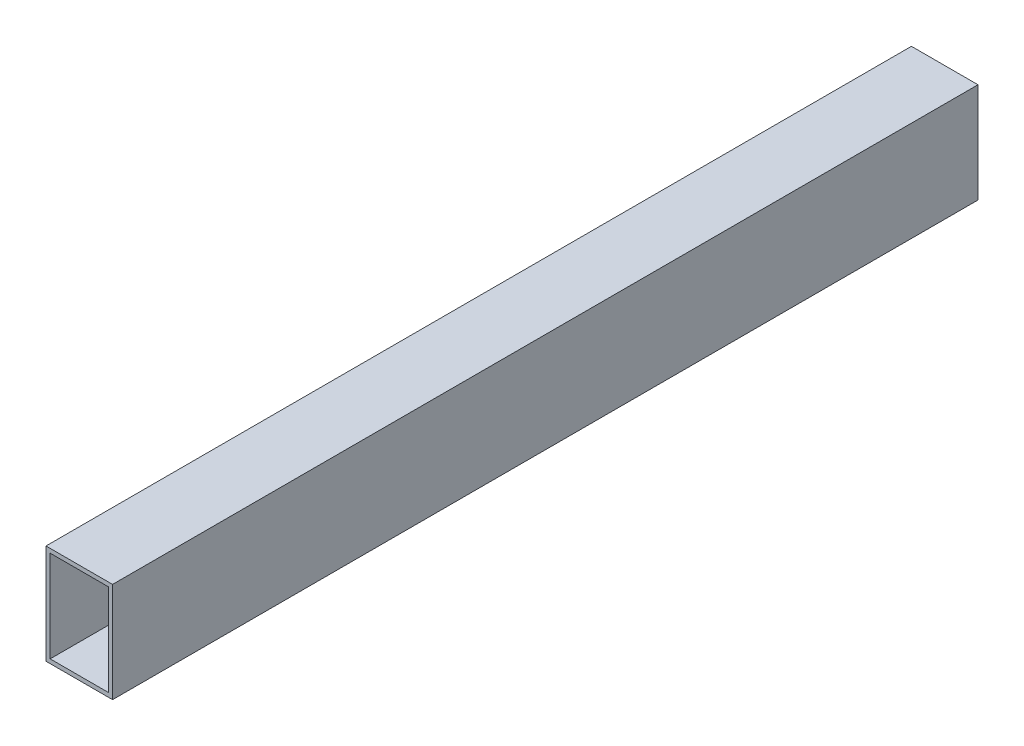
ISO-10303-21;
HEADER;
FILE_DESCRIPTION(('STEP AP214'),'2;1');
FILE_NAME('part.step','',(''),(''),'','','');
FILE_SCHEMA(('AUTOMOTIVE_DESIGN { 1 0 10303 214 1 1 1 1 }'));
ENDSEC;
DATA;
#1=APPLICATION_CONTEXT('core data for automotive mechanical design processes');
#2=APPLICATION_PROTOCOL_DEFINITION('international standard','automotive_design',2000,#1);
#3=PRODUCT_CONTEXT('',#1,'mechanical');
#4=PRODUCT('Part','Part','',(#3));
#5=PRODUCT_RELATED_PRODUCT_CATEGORY('part','',(#4));
#6=PRODUCT_DEFINITION_FORMATION('','',#4);
#7=PRODUCT_DEFINITION_CONTEXT('part definition',#1,'design');
#8=PRODUCT_DEFINITION('design','',#6,#7);
#9=PRODUCT_DEFINITION_SHAPE('','',#8);
#10=(LENGTH_UNIT() NAMED_UNIT(*) SI_UNIT(.MILLI.,.METRE.));
#11=(NAMED_UNIT(*) PLANE_ANGLE_UNIT() SI_UNIT($,.RADIAN.));
#12=(NAMED_UNIT(*) SI_UNIT($,.STERADIAN.) SOLID_ANGLE_UNIT());
#13=UNCERTAINTY_MEASURE_WITH_UNIT(LENGTH_MEASURE(1.E-05),#10,'distance_accuracy_value','');
#14=(GEOMETRIC_REPRESENTATION_CONTEXT(3) GLOBAL_UNCERTAINTY_ASSIGNED_CONTEXT((#13)) GLOBAL_UNIT_ASSIGNED_CONTEXT((#10,
#11,#12)) REPRESENTATION_CONTEXT('',''));
#15=CARTESIAN_POINT('',(0.,0.,0.));
#16=DIRECTION('',(0.,0.,1.));
#17=DIRECTION('',(1.,0.,0.));
#18=AXIS2_PLACEMENT_3D('',#15,#16,#17);
#19=CARTESIAN_POINT('',(25.4,38.1,660.4));
#20=DIRECTION('',(-1.,0.,0.));
#21=DIRECTION('',(0.,-1.,0.));
#22=AXIS2_PLACEMENT_3D('',#19,#20,#21);
#23=PLANE('',#22);
#24=DIRECTION('',(0.,1.,0.));
#25=VECTOR('',#24,1.);
#26=CARTESIAN_POINT('',(25.4,38.1,0.));
#27=LINE('',#26,#25);
#28=CARTESIAN_POINT('',(25.4,-38.1,0.));
#29=VERTEX_POINT('',#28);
#30=CARTESIAN_POINT('',(25.4,38.1,0.));
#31=VERTEX_POINT('',#30);
#32=EDGE_CURVE('E145',#29,#31,#27,.T.);
#33=ORIENTED_EDGE('',*,*,#32,.T.);
#34=DIRECTION('',(0.,0.,-1.));
#35=VECTOR('',#34,1.);
#36=CARTESIAN_POINT('',(25.4,38.1,660.4));
#37=LINE('',#36,#35);
#38=CARTESIAN_POINT('',(25.4,38.1,660.4));
#39=VERTEX_POINT('',#38);
#40=EDGE_CURVE('E11',#39,#31,#37,.T.);
#41=ORIENTED_EDGE('',*,*,#40,.F.);
#42=DIRECTION('',(0.,1.,0.));
#43=VECTOR('',#42,1.);
#44=CARTESIAN_POINT('',(25.4,38.1,660.4));
#45=LINE('',#44,#43);
#46=CARTESIAN_POINT('',(25.4,-38.1,660.4));
#47=VERTEX_POINT('',#46);
#48=EDGE_CURVE('E134',#47,#39,#45,.T.);
#49=ORIENTED_EDGE('',*,*,#48,.F.);
#50=DIRECTION('',(0.,0.,-1.));
#51=VECTOR('',#50,1.);
#52=CARTESIAN_POINT('',(25.4,-38.1,660.4));
#53=LINE('',#52,#51);
#54=EDGE_CURVE('E144',#47,#29,#53,.T.);
#55=ORIENTED_EDGE('',*,*,#54,.T.);
#56=EDGE_LOOP('',(#33,#41,#49,#55));
#57=FACE_BOUND('',#56,.T.);
#58=ADVANCED_FACE('F37',(#57),#23,.F.);
#59=CARTESIAN_POINT('',(-25.4,38.1,660.4));
#60=DIRECTION('',(0.,-1.,0.));
#61=DIRECTION('',(0.,0.,-1.));
#62=AXIS2_PLACEMENT_3D('',#59,#60,#61);
#63=PLANE('',#62);
#64=DIRECTION('',(-1.,0.,0.));
#65=VECTOR('',#64,1.);
#66=CARTESIAN_POINT('',(-25.4,38.1,0.));
#67=LINE('',#66,#65);
#68=CARTESIAN_POINT('',(-25.4,38.1,0.));
#69=VERTEX_POINT('',#68);
#70=EDGE_CURVE('E148',#31,#69,#67,.T.);
#71=ORIENTED_EDGE('',*,*,#70,.T.);
#72=DIRECTION('',(0.,0.,-1.));
#73=VECTOR('',#72,1.);
#74=CARTESIAN_POINT('',(-25.4,38.1,660.4));
#75=LINE('',#74,#73);
#76=CARTESIAN_POINT('',(-25.4,38.1,660.4));
#77=VERTEX_POINT('',#76);
#78=EDGE_CURVE('E44',#77,#69,#75,.T.);
#79=ORIENTED_EDGE('',*,*,#78,.F.);
#80=DIRECTION('',(-1.,0.,0.));
#81=VECTOR('',#80,1.);
#82=CARTESIAN_POINT('',(-25.4,38.1,660.4));
#83=LINE('',#82,#81);
#84=EDGE_CURVE('E137',#39,#77,#83,.T.);
#85=ORIENTED_EDGE('',*,*,#84,.F.);
#86=ORIENTED_EDGE('',*,*,#40,.T.);
#87=EDGE_LOOP('',(#71,#79,#85,#86));
#88=FACE_BOUND('',#87,.T.);
#89=ADVANCED_FACE('F176',(#88),#63,.F.);
#90=CARTESIAN_POINT('',(-25.4,38.1,660.4));
#91=DIRECTION('',(1.,0.,0.));
#92=DIRECTION('',(0.,1.,0.));
#93=AXIS2_PLACEMENT_3D('',#90,#91,#92);
#94=PLANE('',#93);
#95=DIRECTION('',(0.,-1.,0.));
#96=VECTOR('',#95,1.);
#97=CARTESIAN_POINT('',(-25.4,38.1,0.));
#98=LINE('',#97,#96);
#99=CARTESIAN_POINT('',(-25.4,-38.1,0.));
#100=VERTEX_POINT('',#99);
#101=EDGE_CURVE('E150',#69,#100,#98,.T.);
#102=ORIENTED_EDGE('',*,*,#101,.T.);
#103=DIRECTION('',(0.,0.,-1.));
#104=VECTOR('',#103,1.);
#105=CARTESIAN_POINT('',(-25.4,-38.1,660.4));
#106=LINE('',#105,#104);
#107=CARTESIAN_POINT('',(-25.4,-38.1,660.4));
#108=VERTEX_POINT('',#107);
#109=EDGE_CURVE('E155',#108,#100,#106,.T.);
#110=ORIENTED_EDGE('',*,*,#109,.F.);
#111=DIRECTION('',(0.,-1.,0.));
#112=VECTOR('',#111,1.);
#113=CARTESIAN_POINT('',(-25.4,38.1,660.4));
#114=LINE('',#113,#112);
#115=EDGE_CURVE('E140',#77,#108,#114,.T.);
#116=ORIENTED_EDGE('',*,*,#115,.F.);
#117=ORIENTED_EDGE('',*,*,#78,.T.);
#118=EDGE_LOOP('',(#102,#110,#116,#117));
#119=FACE_BOUND('',#118,.T.);
#120=ADVANCED_FACE('F162',(#119),#94,.F.);
#121=CARTESIAN_POINT('',(-25.4,-38.1,660.4));
#122=DIRECTION('',(0.,1.,0.));
#123=DIRECTION('',(0.,0.,1.));
#124=AXIS2_PLACEMENT_3D('',#121,#122,#123);
#125=PLANE('',#124);
#126=DIRECTION('',(1.,0.,0.));
#127=VECTOR('',#126,1.);
#128=CARTESIAN_POINT('',(-25.4,-38.1,0.));
#129=LINE('',#128,#127);
#130=EDGE_CURVE('E138',#100,#29,#129,.T.);
#131=ORIENTED_EDGE('',*,*,#130,.T.);
#132=ORIENTED_EDGE('',*,*,#54,.F.);
#133=DIRECTION('',(1.,0.,0.));
#134=VECTOR('',#133,1.);
#135=CARTESIAN_POINT('',(-25.4,-38.1,660.4));
#136=LINE('',#135,#134);
#137=EDGE_CURVE('E142',#108,#47,#136,.T.);
#138=ORIENTED_EDGE('',*,*,#137,.F.);
#139=ORIENTED_EDGE('',*,*,#109,.T.);
#140=EDGE_LOOP('',(#131,#132,#138,#139));
#141=FACE_BOUND('',#140,.T.);
#142=ADVANCED_FACE('F169',(#141),#125,.F.);
#143=CARTESIAN_POINT('',(0.,0.,660.4));
#144=DIRECTION('',(0.,0.,1.));
#145=DIRECTION('',(1.,0.,0.));
#146=AXIS2_PLACEMENT_3D('',#143,#144,#145);
#147=PLANE('',#146);
#148=DIRECTION('',(0.,1.,0.));
#149=VECTOR('',#148,1.);
#150=CARTESIAN_POINT('',(22.225,38.1,660.4));
#151=LINE('',#150,#149);
#152=CARTESIAN_POINT('',(22.225,-34.925,660.4));
#153=VERTEX_POINT('',#152);
#154=CARTESIAN_POINT('',(22.225,34.925,660.4));
#155=VERTEX_POINT('',#154);
#156=EDGE_CURVE('E122',#153,#155,#151,.T.);
#157=ORIENTED_EDGE('',*,*,#156,.F.);
#158=DIRECTION('',(1.,0.,0.));
#159=VECTOR('',#158,1.);
#160=CARTESIAN_POINT('',(-25.4,-34.925,660.4));
#161=LINE('',#160,#159);
#162=CARTESIAN_POINT('',(-22.225,-34.925,660.4));
#163=VERTEX_POINT('',#162);
#164=EDGE_CURVE('E106',#163,#153,#161,.T.);
#165=ORIENTED_EDGE('',*,*,#164,.F.);
#166=DIRECTION('',(0.,-1.,0.));
#167=VECTOR('',#166,1.);
#168=CARTESIAN_POINT('',(-22.225,38.1,660.4));
#169=LINE('',#168,#167);
#170=CARTESIAN_POINT('',(-22.225,34.925,660.4));
#171=VERTEX_POINT('',#170);
#172=EDGE_CURVE('E131',#171,#163,#169,.T.);
#173=ORIENTED_EDGE('',*,*,#172,.F.);
#174=DIRECTION('',(-1.,0.,0.));
#175=VECTOR('',#174,1.);
#176=CARTESIAN_POINT('',(-25.4,34.925,660.4));
#177=LINE('',#176,#175);
#178=EDGE_CURVE('E124',#155,#171,#177,.T.);
#179=ORIENTED_EDGE('',*,*,#178,.F.);
#180=EDGE_LOOP('',(#157,#165,#173,#179));
#181=FACE_BOUND('',#180,.T.);
#182=ORIENTED_EDGE('',*,*,#48,.T.);
#183=ORIENTED_EDGE('',*,*,#84,.T.);
#184=ORIENTED_EDGE('',*,*,#115,.T.);
#185=ORIENTED_EDGE('',*,*,#137,.T.);
#186=EDGE_LOOP('',(#182,#183,#184,#185));
#187=FACE_BOUND('',#186,.T.);
#188=ADVANCED_FACE('F175',(#181,#187),#147,.T.);
#189=CARTESIAN_POINT('',(0.,0.,0.));
#190=DIRECTION('',(0.,0.,1.));
#191=DIRECTION('',(1.,0.,0.));
#192=AXIS2_PLACEMENT_3D('',#189,#190,#191);
#193=PLANE('',#192);
#194=DIRECTION('',(1.,0.,0.));
#195=VECTOR('',#194,1.);
#196=CARTESIAN_POINT('',(-25.4,-34.925,0.));
#197=LINE('',#196,#195);
#198=CARTESIAN_POINT('',(-22.225,-34.925,0.));
#199=VERTEX_POINT('',#198);
#200=CARTESIAN_POINT('',(22.225,-34.925,0.));
#201=VERTEX_POINT('',#200);
#202=EDGE_CURVE('E104',#199,#201,#197,.T.);
#203=ORIENTED_EDGE('',*,*,#202,.T.);
#204=DIRECTION('',(0.,1.,0.));
#205=VECTOR('',#204,1.);
#206=CARTESIAN_POINT('',(22.225,38.1,0.));
#207=LINE('',#206,#205);
#208=CARTESIAN_POINT('',(22.225,34.925,0.));
#209=VERTEX_POINT('',#208);
#210=EDGE_CURVE('E112',#201,#209,#207,.T.);
#211=ORIENTED_EDGE('',*,*,#210,.T.);
#212=DIRECTION('',(-1.,0.,0.));
#213=VECTOR('',#212,1.);
#214=CARTESIAN_POINT('',(-25.4,34.925,0.));
#215=LINE('',#214,#213);
#216=CARTESIAN_POINT('',(-22.225,34.925,0.));
#217=VERTEX_POINT('',#216);
#218=EDGE_CURVE('E118',#209,#217,#215,.T.);
#219=ORIENTED_EDGE('',*,*,#218,.T.);
#220=DIRECTION('',(0.,-1.,0.));
#221=VECTOR('',#220,1.);
#222=CARTESIAN_POINT('',(-22.225,38.1,0.));
#223=LINE('',#222,#221);
#224=EDGE_CURVE('E58',#217,#199,#223,.T.);
#225=ORIENTED_EDGE('',*,*,#224,.T.);
#226=EDGE_LOOP('',(#203,#211,#219,#225));
#227=FACE_BOUND('',#226,.T.);
#228=ORIENTED_EDGE('',*,*,#32,.F.);
#229=ORIENTED_EDGE('',*,*,#130,.F.);
#230=ORIENTED_EDGE('',*,*,#101,.F.);
#231=ORIENTED_EDGE('',*,*,#70,.F.);
#232=EDGE_LOOP('',(#228,#229,#230,#231));
#233=FACE_BOUND('',#232,.T.);
#234=ADVANCED_FACE('F120',(#227,#233),#193,.F.);
#235=CARTESIAN_POINT('',(22.225,38.1,660.4));
#236=DIRECTION('',(-1.,0.,0.));
#237=DIRECTION('',(0.,-1.,0.));
#238=AXIS2_PLACEMENT_3D('',#235,#236,#237);
#239=PLANE('',#238);
#240=ORIENTED_EDGE('',*,*,#210,.F.);
#241=DIRECTION('',(0.,0.,-1.));
#242=VECTOR('',#241,1.);
#243=CARTESIAN_POINT('',(22.225,-34.925,660.4));
#244=LINE('',#243,#242);
#245=EDGE_CURVE('E100',#153,#201,#244,.T.);
#246=ORIENTED_EDGE('',*,*,#245,.F.);
#247=ORIENTED_EDGE('',*,*,#156,.T.);
#248=DIRECTION('',(0.,0.,-1.));
#249=VECTOR('',#248,1.);
#250=CARTESIAN_POINT('',(22.225,34.925,660.4));
#251=LINE('',#250,#249);
#252=EDGE_CURVE('E115',#155,#209,#251,.T.);
#253=ORIENTED_EDGE('',*,*,#252,.T.);
#254=EDGE_LOOP('',(#240,#246,#247,#253));
#255=FACE_BOUND('',#254,.T.);
#256=ADVANCED_FACE('F113',(#255),#239,.T.);
#257=CARTESIAN_POINT('',(-25.4,34.925,660.4));
#258=DIRECTION('',(0.,-1.,0.));
#259=DIRECTION('',(0.,0.,-1.));
#260=AXIS2_PLACEMENT_3D('',#257,#258,#259);
#261=PLANE('',#260);
#262=ORIENTED_EDGE('',*,*,#218,.F.);
#263=ORIENTED_EDGE('',*,*,#252,.F.);
#264=ORIENTED_EDGE('',*,*,#178,.T.);
#265=DIRECTION('',(0.,0.,-1.));
#266=VECTOR('',#265,1.);
#267=CARTESIAN_POINT('',(-22.225,34.925,660.4));
#268=LINE('',#267,#266);
#269=EDGE_CURVE('E280',#171,#217,#268,.T.);
#270=ORIENTED_EDGE('',*,*,#269,.T.);
#271=EDGE_LOOP('',(#262,#263,#264,#270));
#272=FACE_BOUND('',#271,.T.);
#273=ADVANCED_FACE('F196',(#272),#261,.T.);
#274=CARTESIAN_POINT('',(-22.225,38.1,660.4));
#275=DIRECTION('',(1.,0.,0.));
#276=DIRECTION('',(0.,1.,0.));
#277=AXIS2_PLACEMENT_3D('',#274,#275,#276);
#278=PLANE('',#277);
#279=ORIENTED_EDGE('',*,*,#224,.F.);
#280=ORIENTED_EDGE('',*,*,#269,.F.);
#281=ORIENTED_EDGE('',*,*,#172,.T.);
#282=DIRECTION('',(0.,0.,-1.));
#283=VECTOR('',#282,1.);
#284=CARTESIAN_POINT('',(-22.225,-34.925,660.4));
#285=LINE('',#284,#283);
#286=EDGE_CURVE('E51',#163,#199,#285,.T.);
#287=ORIENTED_EDGE('',*,*,#286,.T.);
#288=EDGE_LOOP('',(#279,#280,#281,#287));
#289=FACE_BOUND('',#288,.T.);
#290=ADVANCED_FACE('F193',(#289),#278,.T.);
#291=CARTESIAN_POINT('',(-25.4,-34.925,660.4));
#292=DIRECTION('',(0.,1.,0.));
#293=DIRECTION('',(0.,0.,1.));
#294=AXIS2_PLACEMENT_3D('',#291,#292,#293);
#295=PLANE('',#294);
#296=ORIENTED_EDGE('',*,*,#202,.F.);
#297=ORIENTED_EDGE('',*,*,#286,.F.);
#298=ORIENTED_EDGE('',*,*,#164,.T.);
#299=ORIENTED_EDGE('',*,*,#245,.T.);
#300=EDGE_LOOP('',(#296,#297,#298,#299));
#301=FACE_BOUND('',#300,.T.);
#302=ADVANCED_FACE('F102',(#301),#295,.T.);
#303=CLOSED_SHELL('',(#58,#89,#120,#142,#188,#234,#256,#273,#290,#302));
#304=MANIFOLD_SOLID_BREP('B2',#303);
#305=ADVANCED_BREP_SHAPE_REPRESENTATION('',(#18,#304),#14);
#306=SHAPE_DEFINITION_REPRESENTATION(#9,#305);
ENDSEC;
END-ISO-10303-21;
